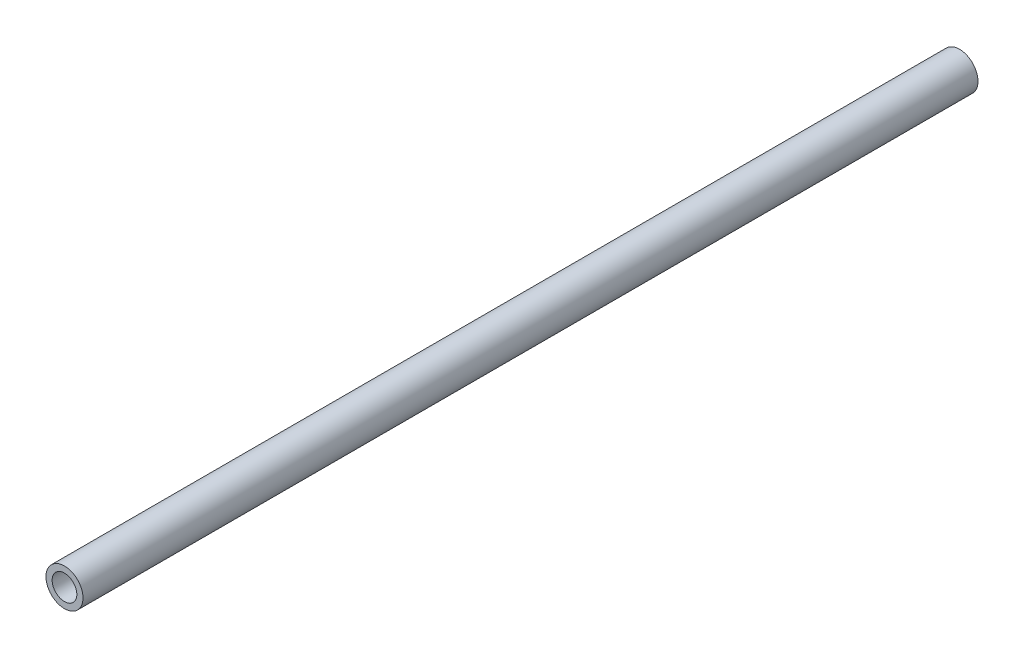
ISO-10303-21;
HEADER;
FILE_DESCRIPTION(('STEP AP214'),'2;1');
FILE_NAME('part.step','',(''),(''),'','','');
FILE_SCHEMA(('AUTOMOTIVE_DESIGN { 1 0 10303 214 1 1 1 1 }'));
ENDSEC;
DATA;
#1=APPLICATION_CONTEXT('core data for automotive mechanical design processes');
#2=APPLICATION_PROTOCOL_DEFINITION('international standard','automotive_design',2000,#1);
#3=PRODUCT_CONTEXT('',#1,'mechanical');
#4=PRODUCT('Part','Part','',(#3));
#5=PRODUCT_RELATED_PRODUCT_CATEGORY('part','',(#4));
#6=PRODUCT_DEFINITION_FORMATION('','',#4);
#7=PRODUCT_DEFINITION_CONTEXT('part definition',#1,'design');
#8=PRODUCT_DEFINITION('design','',#6,#7);
#9=PRODUCT_DEFINITION_SHAPE('','',#8);
#10=(LENGTH_UNIT() NAMED_UNIT(*) SI_UNIT(.MILLI.,.METRE.));
#11=(NAMED_UNIT(*) PLANE_ANGLE_UNIT() SI_UNIT($,.RADIAN.));
#12=(NAMED_UNIT(*) SI_UNIT($,.STERADIAN.) SOLID_ANGLE_UNIT());
#13=UNCERTAINTY_MEASURE_WITH_UNIT(LENGTH_MEASURE(1.E-05),#10,'distance_accuracy_value','');
#14=(GEOMETRIC_REPRESENTATION_CONTEXT(3) GLOBAL_UNCERTAINTY_ASSIGNED_CONTEXT((#13)) GLOBAL_UNIT_ASSIGNED_CONTEXT((#10,
#11,#12)) REPRESENTATION_CONTEXT('',''));
#15=CARTESIAN_POINT('',(0.,0.,0.));
#16=DIRECTION('',(0.,0.,1.));
#17=DIRECTION('',(1.,0.,0.));
#18=AXIS2_PLACEMENT_3D('',#15,#16,#17);
#19=CARTESIAN_POINT('',(0.,0.,72.5));
#20=DIRECTION('',(0.,0.,1.));
#21=DIRECTION('',(1.,0.,0.));
#22=AXIS2_PLACEMENT_3D('',#19,#20,#21);
#23=PLANE('',#22);
#24=CARTESIAN_POINT('',(0.,0.,72.5));
#25=DIRECTION('',(0.,0.,1.));
#26=DIRECTION('',(1.,0.,0.));
#27=AXIS2_PLACEMENT_3D('',#24,#25,#26);
#28=CIRCLE('',#27,3.);
#29=CARTESIAN_POINT('',(3.,0.,72.5));
#30=VERTEX_POINT('',#29);
#31=EDGE_CURVE('E10',#30,#30,#28,.T.);
#32=ORIENTED_EDGE('',*,*,#31,.T.);
#33=EDGE_LOOP('',(#32));
#34=FACE_BOUND('',#33,.T.);
#35=CARTESIAN_POINT('',(0.,0.,72.5));
#36=DIRECTION('',(0.,0.,1.));
#37=DIRECTION('',(1.,0.,0.));
#38=AXIS2_PLACEMENT_3D('',#35,#36,#37);
#39=CIRCLE('',#38,2.);
#40=CARTESIAN_POINT('',(2.,0.,72.5));
#41=VERTEX_POINT('',#40);
#42=EDGE_CURVE('E44',#41,#41,#39,.T.);
#43=ORIENTED_EDGE('',*,*,#42,.F.);
#44=EDGE_LOOP('',(#43));
#45=FACE_BOUND('',#44,.T.);
#46=ADVANCED_FACE('F33',(#34,#45),#23,.T.);
#47=CARTESIAN_POINT('',(0.,0.,-72.5));
#48=DIRECTION('',(0.,0.,1.));
#49=DIRECTION('',(1.,0.,0.));
#50=AXIS2_PLACEMENT_3D('',#47,#48,#49);
#51=PLANE('',#50);
#52=CARTESIAN_POINT('',(0.,0.,-72.5));
#53=DIRECTION('',(0.,0.,1.));
#54=DIRECTION('',(1.,0.,0.));
#55=AXIS2_PLACEMENT_3D('',#52,#53,#54);
#56=CIRCLE('',#55,3.);
#57=CARTESIAN_POINT('',(3.,0.,-72.5));
#58=VERTEX_POINT('',#57);
#59=EDGE_CURVE('E37',#58,#58,#56,.T.);
#60=ORIENTED_EDGE('',*,*,#59,.F.);
#61=EDGE_LOOP('',(#60));
#62=FACE_BOUND('',#61,.T.);
#63=CARTESIAN_POINT('',(0.,0.,-72.5));
#64=DIRECTION('',(0.,0.,1.));
#65=DIRECTION('',(1.,0.,0.));
#66=AXIS2_PLACEMENT_3D('',#63,#64,#65);
#67=CIRCLE('',#66,2.);
#68=CARTESIAN_POINT('',(2.,0.,-72.5));
#69=VERTEX_POINT('',#68);
#70=EDGE_CURVE('E46',#69,#69,#67,.T.);
#71=ORIENTED_EDGE('',*,*,#70,.T.);
#72=EDGE_LOOP('',(#71));
#73=FACE_BOUND('',#72,.T.);
#74=ADVANCED_FACE('F56',(#62,#73),#51,.F.);
#75=CARTESIAN_POINT('',(0.,0.,72.5));
#76=DIRECTION('',(0.,0.,-1.));
#77=DIRECTION('',(-1.,0.,0.));
#78=AXIS2_PLACEMENT_3D('',#75,#76,#77);
#79=CYLINDRICAL_SURFACE('',#78,3.);
#80=ORIENTED_EDGE('',*,*,#31,.F.);
#81=EDGE_LOOP('',(#80));
#82=FACE_BOUND('',#81,.T.);
#83=ORIENTED_EDGE('',*,*,#59,.T.);
#84=EDGE_LOOP('',(#83));
#85=FACE_BOUND('',#84,.T.);
#86=ADVANCED_FACE('F35',(#82,#85),#79,.T.);
#87=CARTESIAN_POINT('',(0.,0.,72.5));
#88=DIRECTION('',(0.,0.,-1.));
#89=DIRECTION('',(-1.,0.,0.));
#90=AXIS2_PLACEMENT_3D('',#87,#88,#89);
#91=CYLINDRICAL_SURFACE('',#90,2.);
#92=ORIENTED_EDGE('',*,*,#42,.T.);
#93=EDGE_LOOP('',(#92));
#94=FACE_BOUND('',#93,.T.);
#95=ORIENTED_EDGE('',*,*,#70,.F.);
#96=EDGE_LOOP('',(#95));
#97=FACE_BOUND('',#96,.T.);
#98=ADVANCED_FACE('F52',(#94,#97),#91,.F.);
#99=CLOSED_SHELL('',(#46,#74,#86,#98));
#100=MANIFOLD_SOLID_BREP('B2',#99);
#101=ADVANCED_BREP_SHAPE_REPRESENTATION('',(#18,#100),#14);
#102=SHAPE_DEFINITION_REPRESENTATION(#9,#101);
ENDSEC;
END-ISO-10303-21;
